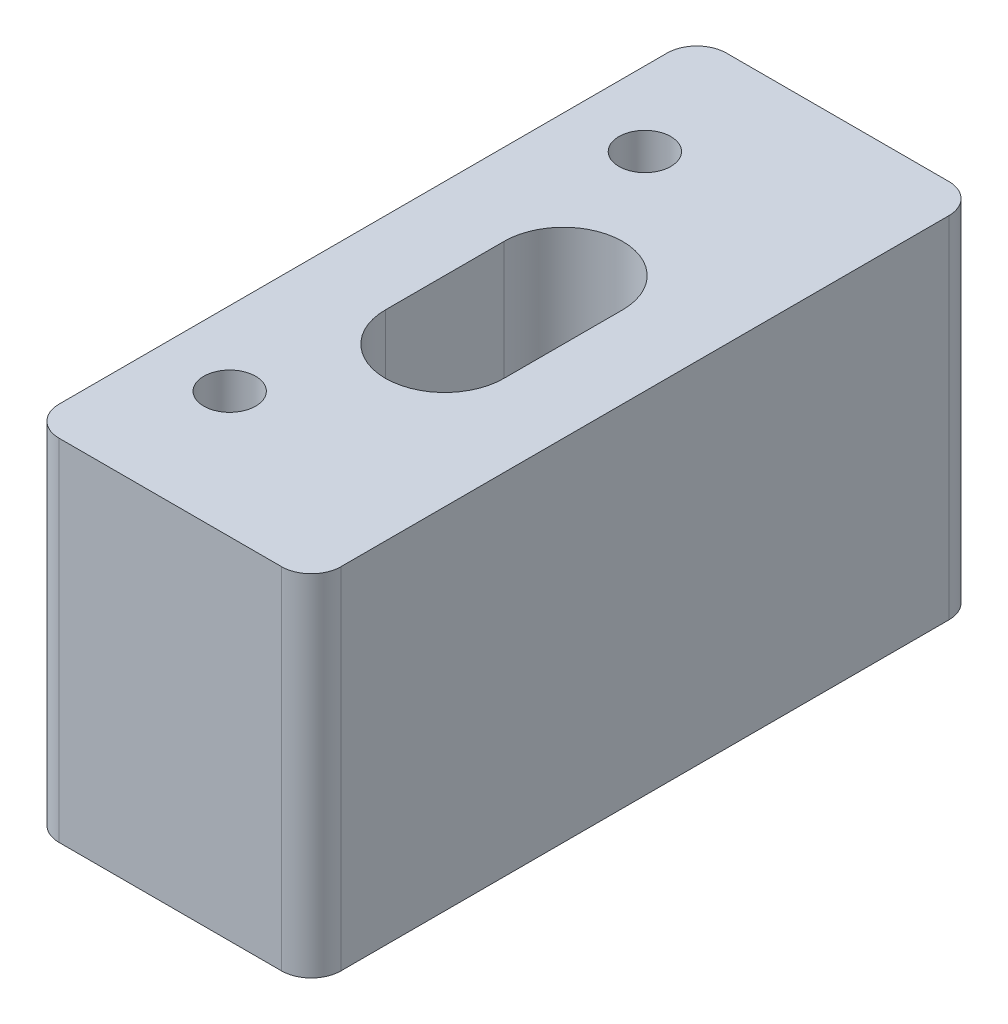
ISO-10303-21;
HEADER;
FILE_DESCRIPTION(('STEP AP214'),'2;1');
FILE_NAME('part.step','',(''),(''),'','','');
FILE_SCHEMA(('AUTOMOTIVE_DESIGN { 1 0 10303 214 1 1 1 1 }'));
ENDSEC;
DATA;
#1=APPLICATION_CONTEXT('core data for automotive mechanical design processes');
#2=APPLICATION_PROTOCOL_DEFINITION('international standard','automotive_design',2000,#1);
#3=PRODUCT_CONTEXT('',#1,'mechanical');
#4=PRODUCT('Part','Part','',(#3));
#5=PRODUCT_RELATED_PRODUCT_CATEGORY('part','',(#4));
#6=PRODUCT_DEFINITION_FORMATION('','',#4);
#7=PRODUCT_DEFINITION_CONTEXT('part definition',#1,'design');
#8=PRODUCT_DEFINITION('design','',#6,#7);
#9=PRODUCT_DEFINITION_SHAPE('','',#8);
#10=(LENGTH_UNIT() NAMED_UNIT(*) SI_UNIT(.MILLI.,.METRE.));
#11=(NAMED_UNIT(*) PLANE_ANGLE_UNIT() SI_UNIT($,.RADIAN.));
#12=(NAMED_UNIT(*) SI_UNIT($,.STERADIAN.) SOLID_ANGLE_UNIT());
#13=UNCERTAINTY_MEASURE_WITH_UNIT(LENGTH_MEASURE(1.E-05),#10,'distance_accuracy_value','');
#14=(GEOMETRIC_REPRESENTATION_CONTEXT(3) GLOBAL_UNCERTAINTY_ASSIGNED_CONTEXT((#13)) GLOBAL_UNIT_ASSIGNED_CONTEXT((#10,
#11,#12)) REPRESENTATION_CONTEXT('',''));
#15=CARTESIAN_POINT('',(0.,0.,0.));
#16=DIRECTION('',(0.,0.,1.));
#17=DIRECTION('',(1.,0.,0.));
#18=AXIS2_PLACEMENT_3D('',#15,#16,#17);
#19=CARTESIAN_POINT('',(0.,0.,0.));
#20=DIRECTION('',(0.,1.,0.));
#21=DIRECTION('',(0.,0.,1.));
#22=AXIS2_PLACEMENT_3D('',#19,#20,#21);
#23=PLANE('',#22);
#24=DIRECTION('',(0.,0.,-1.));
#25=VECTOR('',#24,1.);
#26=CARTESIAN_POINT('',(8.49999999999999,0.,-4.));
#27=LINE('',#26,#25);
#28=CARTESIAN_POINT('',(8.49999999999999,0.,4.));
#29=VERTEX_POINT('',#28);
#30=CARTESIAN_POINT('',(8.49999999999999,0.,-4.));
#31=VERTEX_POINT('',#30);
#32=EDGE_CURVE('E139',#29,#31,#27,.T.);
#33=ORIENTED_EDGE('',*,*,#32,.T.);
#34=CARTESIAN_POINT('',(4.49999999999999,0.,-4.));
#35=DIRECTION('',(0.,1.,0.));
#36=DIRECTION('',(0.,0.,1.));
#37=AXIS2_PLACEMENT_3D('',#34,#35,#36);
#38=CIRCLE('',#37,4.);
#39=CARTESIAN_POINT('',(0.499999999999994,0.,-4.));
#40=VERTEX_POINT('',#39);
#41=EDGE_CURVE('E156',#31,#40,#38,.T.);
#42=ORIENTED_EDGE('',*,*,#41,.T.);
#43=DIRECTION('',(0.,0.,1.));
#44=VECTOR('',#43,1.);
#45=CARTESIAN_POINT('',(0.499999999999994,0.,-4.));
#46=LINE('',#45,#44);
#47=CARTESIAN_POINT('',(0.499999999999994,0.,4.));
#48=VERTEX_POINT('',#47);
#49=EDGE_CURVE('E133',#40,#48,#46,.T.);
#50=ORIENTED_EDGE('',*,*,#49,.T.);
#51=CARTESIAN_POINT('',(4.49999999999999,0.,4.));
#52=DIRECTION('',(0.,1.,0.));
#53=DIRECTION('',(0.,0.,1.));
#54=AXIS2_PLACEMENT_3D('',#51,#52,#53);
#55=CIRCLE('',#54,4.);
#56=EDGE_CURVE('E53',#48,#29,#55,.T.);
#57=ORIENTED_EDGE('',*,*,#56,.T.);
#58=EDGE_LOOP('',(#33,#42,#50,#57));
#59=FACE_BOUND('',#58,.T.);
#60=DIRECTION('',(0.,0.,1.));
#61=VECTOR('',#60,1.);
#62=CARTESIAN_POINT('',(-5.00000000000001,0.,-22.5));
#63=LINE('',#62,#61);
#64=CARTESIAN_POINT('',(-5.00000000000001,0.,-20.5));
#65=VERTEX_POINT('',#64);
#66=CARTESIAN_POINT('',(-5.00000000000001,0.,20.5));
#67=VERTEX_POINT('',#66);
#68=EDGE_CURVE('E182',#65,#67,#63,.T.);
#69=ORIENTED_EDGE('',*,*,#68,.F.);
#70=CARTESIAN_POINT('',(-3.00000000000001,0.,-20.5));
#71=DIRECTION('',(0.,1.,0.));
#72=DIRECTION('',(0.,0.,1.));
#73=AXIS2_PLACEMENT_3D('',#70,#71,#72);
#74=CIRCLE('',#73,2.);
#75=CARTESIAN_POINT('',(-3.00000000000001,0.,-22.5));
#76=VERTEX_POINT('',#75);
#77=EDGE_CURVE('E203',#65,#76,#74,.F.);
#78=ORIENTED_EDGE('',*,*,#77,.T.);
#79=DIRECTION('',(-1.,0.,0.));
#80=VECTOR('',#79,1.);
#81=CARTESIAN_POINT('',(-5.00000000000001,0.,-22.5));
#82=LINE('',#81,#80);
#83=CARTESIAN_POINT('',(12.,0.,-22.5));
#84=VERTEX_POINT('',#83);
#85=EDGE_CURVE('E190',#84,#76,#82,.T.);
#86=ORIENTED_EDGE('',*,*,#85,.F.);
#87=CARTESIAN_POINT('',(12.,0.,-20.5));
#88=DIRECTION('',(0.,1.,0.));
#89=DIRECTION('',(0.,0.,1.));
#90=AXIS2_PLACEMENT_3D('',#87,#88,#89);
#91=CIRCLE('',#90,2.);
#92=CARTESIAN_POINT('',(14.,0.,-20.5));
#93=VERTEX_POINT('',#92);
#94=EDGE_CURVE('E201',#84,#93,#91,.F.);
#95=ORIENTED_EDGE('',*,*,#94,.T.);
#96=DIRECTION('',(0.,0.,-1.));
#97=VECTOR('',#96,1.);
#98=CARTESIAN_POINT('',(14.,0.,-22.5));
#99=LINE('',#98,#97);
#100=CARTESIAN_POINT('',(14.,0.,20.5));
#101=VERTEX_POINT('',#100);
#102=EDGE_CURVE('E187',#101,#93,#99,.T.);
#103=ORIENTED_EDGE('',*,*,#102,.F.);
#104=CARTESIAN_POINT('',(12.,0.,20.5));
#105=DIRECTION('',(0.,1.,0.));
#106=DIRECTION('',(0.,0.,1.));
#107=AXIS2_PLACEMENT_3D('',#104,#105,#106);
#108=CIRCLE('',#107,2.);
#109=CARTESIAN_POINT('',(12.,0.,22.5));
#110=VERTEX_POINT('',#109);
#111=EDGE_CURVE('E61',#101,#110,#108,.F.);
#112=ORIENTED_EDGE('',*,*,#111,.T.);
#113=DIRECTION('',(1.,0.,0.));
#114=VECTOR('',#113,1.);
#115=CARTESIAN_POINT('',(-5.00000000000001,0.,22.5));
#116=LINE('',#115,#114);
#117=CARTESIAN_POINT('',(-3.00000000000001,0.,22.5));
#118=VERTEX_POINT('',#117);
#119=EDGE_CURVE('E185',#118,#110,#116,.T.);
#120=ORIENTED_EDGE('',*,*,#119,.F.);
#121=CARTESIAN_POINT('',(-3.00000000000001,0.,20.5));
#122=DIRECTION('',(0.,1.,0.));
#123=DIRECTION('',(0.,0.,1.));
#124=AXIS2_PLACEMENT_3D('',#121,#122,#123);
#125=CIRCLE('',#124,2.);
#126=EDGE_CURVE('E199',#118,#67,#125,.F.);
#127=ORIENTED_EDGE('',*,*,#126,.T.);
#128=EDGE_LOOP('',(#69,#78,#86,#95,#103,#112,#120,#127));
#129=FACE_BOUND('',#128,.T.);
#130=CARTESIAN_POINT('',(0.,0.,14.));
#131=DIRECTION('',(0.,1.,0.));
#132=DIRECTION('',(0.,0.,1.));
#133=AXIS2_PLACEMENT_3D('',#130,#131,#132);
#134=CIRCLE('',#133,1.75);
#135=CARTESIAN_POINT('',(0.,0.,15.75));
#136=VERTEX_POINT('',#135);
#137=EDGE_CURVE('E179',#136,#136,#134,.T.);
#138=ORIENTED_EDGE('',*,*,#137,.T.);
#139=EDGE_LOOP('',(#138));
#140=FACE_BOUND('',#139,.T.);
#141=CARTESIAN_POINT('',(0.,0.,-14.));
#142=DIRECTION('',(0.,1.,0.));
#143=DIRECTION('',(0.,0.,1.));
#144=AXIS2_PLACEMENT_3D('',#141,#142,#143);
#145=CIRCLE('',#144,1.75);
#146=CARTESIAN_POINT('',(0.,0.,-12.25));
#147=VERTEX_POINT('',#146);
#148=EDGE_CURVE('E173',#147,#147,#145,.T.);
#149=ORIENTED_EDGE('',*,*,#148,.T.);
#150=EDGE_LOOP('',(#149));
#151=FACE_BOUND('',#150,.T.);
#152=ADVANCED_FACE('F38',(#59,#129,#140,#151),#23,.F.);
#153=CARTESIAN_POINT('',(-5.00000000000001,2.,-22.5));
#154=DIRECTION('',(1.,0.,0.));
#155=DIRECTION('',(0.,0.,-1.));
#156=AXIS2_PLACEMENT_3D('',#153,#154,#155);
#157=PLANE('',#156);
#158=DIRECTION('',(0.,-1.,0.));
#159=VECTOR('',#158,1.);
#160=CARTESIAN_POINT('',(-5.00000000000001,2.,20.5));
#161=LINE('',#160,#159);
#162=CARTESIAN_POINT('',(-5.00000000000001,23.6126983722067,20.5));
#163=VERTEX_POINT('',#162);
#164=EDGE_CURVE('E193',#67,#163,#161,.F.);
#165=ORIENTED_EDGE('',*,*,#164,.T.);
#166=DIRECTION('',(0.,0.,-1.));
#167=VECTOR('',#166,1.);
#168=CARTESIAN_POINT('',(-5.00000000000001,23.6126983722068,-20.5000000000001));
#169=LINE('',#168,#167);
#170=CARTESIAN_POINT('',(-5.00000000000001,23.6126983722068,-20.5));
#171=VERTEX_POINT('',#170);
#172=EDGE_CURVE('E236',#163,#171,#169,.T.);
#173=ORIENTED_EDGE('',*,*,#172,.T.);
#174=DIRECTION('',(0.,-1.,0.));
#175=VECTOR('',#174,1.);
#176=CARTESIAN_POINT('',(-5.00000000000001,2.,-20.5));
#177=LINE('',#176,#175);
#178=EDGE_CURVE('E195',#171,#65,#177,.T.);
#179=ORIENTED_EDGE('',*,*,#178,.T.);
#180=ORIENTED_EDGE('',*,*,#68,.T.);
#181=EDGE_LOOP('',(#165,#173,#179,#180));
#182=FACE_BOUND('',#181,.T.);
#183=ADVANCED_FACE('F259',(#182),#157,.F.);
#184=CARTESIAN_POINT('',(-5.00000000000001,2.,22.5));
#185=DIRECTION('',(0.,0.,-1.));
#186=DIRECTION('',(-1.,0.,0.));
#187=AXIS2_PLACEMENT_3D('',#184,#185,#186);
#188=PLANE('',#187);
#189=DIRECTION('',(0.,-1.,0.));
#190=VECTOR('',#189,1.);
#191=CARTESIAN_POINT('',(12.,2.,22.5));
#192=LINE('',#191,#190);
#193=CARTESIAN_POINT('',(12.,23.6126983722068,22.5));
#194=VERTEX_POINT('',#193);
#195=EDGE_CURVE('E46',#110,#194,#192,.F.);
#196=ORIENTED_EDGE('',*,*,#195,.T.);
#197=DIRECTION('',(-1.,0.,0.));
#198=VECTOR('',#197,1.);
#199=CARTESIAN_POINT('',(-2.9999999999999,23.6126983722067,22.5));
#200=LINE('',#199,#198);
#201=CARTESIAN_POINT('',(-3.00000000000001,23.6126983722067,22.5));
#202=VERTEX_POINT('',#201);
#203=EDGE_CURVE('E219',#194,#202,#200,.T.);
#204=ORIENTED_EDGE('',*,*,#203,.T.);
#205=DIRECTION('',(0.,-1.,0.));
#206=VECTOR('',#205,1.);
#207=CARTESIAN_POINT('',(-3.00000000000001,2.,22.5));
#208=LINE('',#207,#206);
#209=EDGE_CURVE('E11',#202,#118,#208,.T.);
#210=ORIENTED_EDGE('',*,*,#209,.T.);
#211=ORIENTED_EDGE('',*,*,#119,.T.);
#212=EDGE_LOOP('',(#196,#204,#210,#211));
#213=FACE_BOUND('',#212,.T.);
#214=ADVANCED_FACE('F218',(#213),#188,.F.);
#215=CARTESIAN_POINT('',(14.,2.,-22.5));
#216=DIRECTION('',(-1.,0.,0.));
#217=DIRECTION('',(0.,0.,1.));
#218=AXIS2_PLACEMENT_3D('',#215,#216,#217);
#219=PLANE('',#218);
#220=ORIENTED_EDGE('',*,*,#102,.T.);
#221=DIRECTION('',(0.,-1.,0.));
#222=VECTOR('',#221,1.);
#223=CARTESIAN_POINT('',(14.,2.,-20.5));
#224=LINE('',#223,#222);
#225=CARTESIAN_POINT('',(14.,23.6126983722068,-20.5));
#226=VERTEX_POINT('',#225);
#227=EDGE_CURVE('E213',#93,#226,#224,.F.);
#228=ORIENTED_EDGE('',*,*,#227,.T.);
#229=DIRECTION('',(0.,0.,1.));
#230=VECTOR('',#229,1.);
#231=CARTESIAN_POINT('',(14.,23.6126983722068,20.4999999999999));
#232=LINE('',#231,#230);
#233=CARTESIAN_POINT('',(14.,23.6126983722068,20.5));
#234=VERTEX_POINT('',#233);
#235=EDGE_CURVE('E166',#226,#234,#232,.T.);
#236=ORIENTED_EDGE('',*,*,#235,.T.);
#237=DIRECTION('',(0.,-1.,0.));
#238=VECTOR('',#237,1.);
#239=CARTESIAN_POINT('',(14.,2.,20.5));
#240=LINE('',#239,#238);
#241=EDGE_CURVE('E210',#234,#101,#240,.T.);
#242=ORIENTED_EDGE('',*,*,#241,.T.);
#243=EDGE_LOOP('',(#220,#228,#236,#242));
#244=FACE_BOUND('',#243,.T.);
#245=ADVANCED_FACE('F266',(#244),#219,.F.);
#246=CARTESIAN_POINT('',(-5.00000000000001,2.,-22.5));
#247=DIRECTION('',(0.,0.,1.));
#248=DIRECTION('',(1.,0.,0.));
#249=AXIS2_PLACEMENT_3D('',#246,#247,#248);
#250=PLANE('',#249);
#251=ORIENTED_EDGE('',*,*,#85,.T.);
#252=DIRECTION('',(0.,-1.,0.));
#253=VECTOR('',#252,1.);
#254=CARTESIAN_POINT('',(-3.00000000000001,2.,-22.5));
#255=LINE('',#254,#253);
#256=CARTESIAN_POINT('',(-3.00000000000001,23.6126983722068,-22.5));
#257=VERTEX_POINT('',#256);
#258=EDGE_CURVE('E208',#76,#257,#255,.F.);
#259=ORIENTED_EDGE('',*,*,#258,.T.);
#260=DIRECTION('',(1.,0.,0.));
#261=VECTOR('',#260,1.);
#262=CARTESIAN_POINT('',(12.0000000000001,23.6126983722068,-22.5));
#263=LINE('',#262,#261);
#264=CARTESIAN_POINT('',(12.,23.6126983722068,-22.5));
#265=VERTEX_POINT('',#264);
#266=EDGE_CURVE('E242',#257,#265,#263,.T.);
#267=ORIENTED_EDGE('',*,*,#266,.T.);
#268=DIRECTION('',(0.,-1.,0.));
#269=VECTOR('',#268,1.);
#270=CARTESIAN_POINT('',(12.,2.,-22.5));
#271=LINE('',#270,#269);
#272=EDGE_CURVE('E205',#265,#84,#271,.T.);
#273=ORIENTED_EDGE('',*,*,#272,.T.);
#274=EDGE_LOOP('',(#251,#259,#267,#273));
#275=FACE_BOUND('',#274,.T.);
#276=ADVANCED_FACE('F253',(#275),#250,.F.);
#277=CARTESIAN_POINT('',(0.,2.,14.));
#278=DIRECTION('',(0.,-1.,0.));
#279=DIRECTION('',(0.,0.,-1.));
#280=AXIS2_PLACEMENT_3D('',#277,#278,#279);
#281=CYLINDRICAL_SURFACE('',#280,1.75);
#282=ORIENTED_EDGE('',*,*,#137,.F.);
#283=EDGE_LOOP('',(#282));
#284=FACE_BOUND('',#283,.T.);
#285=CARTESIAN_POINT('',(0.,23.6126983722068,14.));
#286=DIRECTION('',(0.,-1.,0.));
#287=DIRECTION('',(1.,0.,0.));
#288=AXIS2_PLACEMENT_3D('',#285,#286,#287);
#289=CIRCLE('',#288,1.75);
#290=CARTESIAN_POINT('',(1.75,23.6126983722068,14.));
#291=VERTEX_POINT('',#290);
#292=EDGE_CURVE('E163',#291,#291,#289,.T.);
#293=ORIENTED_EDGE('',*,*,#292,.F.);
#294=EDGE_LOOP('',(#293));
#295=FACE_BOUND('',#294,.T.);
#296=ADVANCED_FACE('F273',(#284,#295),#281,.F.);
#297=CARTESIAN_POINT('',(0.,2.,-14.));
#298=DIRECTION('',(0.,-1.,0.));
#299=DIRECTION('',(0.,0.,-1.));
#300=AXIS2_PLACEMENT_3D('',#297,#298,#299);
#301=CYLINDRICAL_SURFACE('',#300,1.75);
#302=ORIENTED_EDGE('',*,*,#148,.F.);
#303=EDGE_LOOP('',(#302));
#304=FACE_BOUND('',#303,.T.);
#305=CARTESIAN_POINT('',(0.,23.6126983722068,-14.));
#306=DIRECTION('',(0.,-1.,0.));
#307=DIRECTION('',(1.,0.,0.));
#308=AXIS2_PLACEMENT_3D('',#305,#306,#307);
#309=CIRCLE('',#308,1.75);
#310=CARTESIAN_POINT('',(1.75,23.6126983722068,-14.));
#311=VERTEX_POINT('',#310);
#312=EDGE_CURVE('E160',#311,#311,#309,.T.);
#313=ORIENTED_EDGE('',*,*,#312,.F.);
#314=EDGE_LOOP('',(#313));
#315=FACE_BOUND('',#314,.T.);
#316=ADVANCED_FACE('F286',(#304,#315),#301,.F.);
#317=CARTESIAN_POINT('',(-3.00000000000001,2.,-20.5));
#318=DIRECTION('',(0.,-1.,0.));
#319=DIRECTION('',(0.,0.,-1.));
#320=AXIS2_PLACEMENT_3D('',#317,#318,#319);
#321=CYLINDRICAL_SURFACE('',#320,2.);
#322=ORIENTED_EDGE('',*,*,#178,.F.);
#323=CARTESIAN_POINT('',(-3.00000000000001,23.6126983722068,-20.5));
#324=DIRECTION('',(0.,-1.,0.));
#325=DIRECTION('',(1.,0.,0.));
#326=AXIS2_PLACEMENT_3D('',#323,#324,#325);
#327=CIRCLE('',#326,2.);
#328=EDGE_CURVE('E239',#171,#257,#327,.T.);
#329=ORIENTED_EDGE('',*,*,#328,.T.);
#330=ORIENTED_EDGE('',*,*,#258,.F.);
#331=ORIENTED_EDGE('',*,*,#77,.F.);
#332=EDGE_LOOP('',(#322,#329,#330,#331));
#333=FACE_BOUND('',#332,.T.);
#334=ADVANCED_FACE('F257',(#333),#321,.T.);
#335=CARTESIAN_POINT('',(12.,2.,-20.5));
#336=DIRECTION('',(0.,-1.,0.));
#337=DIRECTION('',(0.,0.,-1.));
#338=AXIS2_PLACEMENT_3D('',#335,#336,#337);
#339=CYLINDRICAL_SURFACE('',#338,2.);
#340=ORIENTED_EDGE('',*,*,#272,.F.);
#341=CARTESIAN_POINT('',(12.,23.6126983722068,-20.5));
#342=DIRECTION('',(0.,-1.,0.));
#343=DIRECTION('',(1.,0.,0.));
#344=AXIS2_PLACEMENT_3D('',#341,#342,#343);
#345=CIRCLE('',#344,2.);
#346=EDGE_CURVE('E245',#265,#226,#345,.T.);
#347=ORIENTED_EDGE('',*,*,#346,.T.);
#348=ORIENTED_EDGE('',*,*,#227,.F.);
#349=ORIENTED_EDGE('',*,*,#94,.F.);
#350=EDGE_LOOP('',(#340,#347,#348,#349));
#351=FACE_BOUND('',#350,.T.);
#352=ADVANCED_FACE('F250',(#351),#339,.T.);
#353=CARTESIAN_POINT('',(-3.00000000000001,2.,20.5));
#354=DIRECTION('',(0.,-1.,0.));
#355=DIRECTION('',(0.,0.,-1.));
#356=AXIS2_PLACEMENT_3D('',#353,#354,#355);
#357=CYLINDRICAL_SURFACE('',#356,2.);
#358=ORIENTED_EDGE('',*,*,#209,.F.);
#359=CARTESIAN_POINT('',(-3.00000000000001,23.6126983722067,20.5));
#360=DIRECTION('',(0.,-1.,0.));
#361=DIRECTION('',(1.,0.,0.));
#362=AXIS2_PLACEMENT_3D('',#359,#360,#361);
#363=CIRCLE('',#362,2.);
#364=EDGE_CURVE('E230',#202,#163,#363,.T.);
#365=ORIENTED_EDGE('',*,*,#364,.T.);
#366=ORIENTED_EDGE('',*,*,#164,.F.);
#367=ORIENTED_EDGE('',*,*,#126,.F.);
#368=EDGE_LOOP('',(#358,#365,#366,#367));
#369=FACE_BOUND('',#368,.T.);
#370=ADVANCED_FACE('F263',(#369),#357,.T.);
#371=CARTESIAN_POINT('',(12.,2.,20.5));
#372=DIRECTION('',(0.,-1.,0.));
#373=DIRECTION('',(0.,0.,-1.));
#374=AXIS2_PLACEMENT_3D('',#371,#372,#373);
#375=CYLINDRICAL_SURFACE('',#374,2.);
#376=ORIENTED_EDGE('',*,*,#241,.F.);
#377=CARTESIAN_POINT('',(12.,23.6126983722068,20.5));
#378=DIRECTION('',(0.,-1.,0.));
#379=DIRECTION('',(1.,0.,0.));
#380=AXIS2_PLACEMENT_3D('',#377,#378,#379);
#381=CIRCLE('',#380,2.);
#382=EDGE_CURVE('E226',#234,#194,#381,.T.);
#383=ORIENTED_EDGE('',*,*,#382,.T.);
#384=ORIENTED_EDGE('',*,*,#195,.F.);
#385=ORIENTED_EDGE('',*,*,#111,.F.);
#386=EDGE_LOOP('',(#376,#383,#384,#385));
#387=FACE_BOUND('',#386,.T.);
#388=ADVANCED_FACE('F40',(#387),#375,.T.);
#389=CARTESIAN_POINT('',(4.49999999999999,0.,-4.));
#390=DIRECTION('',(0.,1.,0.));
#391=DIRECTION('',(0.,0.,1.));
#392=AXIS2_PLACEMENT_3D('',#389,#390,#391);
#393=CYLINDRICAL_SURFACE('',#392,4.);
#394=DIRECTION('',(0.,1.,0.));
#395=VECTOR('',#394,1.);
#396=CARTESIAN_POINT('',(8.49999999999999,0.,-4.));
#397=LINE('',#396,#395);
#398=CARTESIAN_POINT('',(8.49999999999999,23.6126983722068,-4.));
#399=VERTEX_POINT('',#398);
#400=EDGE_CURVE('E153',#31,#399,#397,.T.);
#401=ORIENTED_EDGE('',*,*,#400,.T.);
#402=CARTESIAN_POINT('',(4.49999999999999,23.6126983722068,-4.));
#403=DIRECTION('',(0.,-1.,0.));
#404=DIRECTION('',(1.,0.,0.));
#405=AXIS2_PLACEMENT_3D('',#402,#403,#404);
#406=CIRCLE('',#405,4.);
#407=CARTESIAN_POINT('',(0.499999999999994,23.6126983722068,-4.));
#408=VERTEX_POINT('',#407);
#409=EDGE_CURVE('E147',#408,#399,#406,.T.);
#410=ORIENTED_EDGE('',*,*,#409,.F.);
#411=DIRECTION('',(0.,1.,0.));
#412=VECTOR('',#411,1.);
#413=CARTESIAN_POINT('',(0.499999999999994,0.,-4.));
#414=LINE('',#413,#412);
#415=EDGE_CURVE('E128',#40,#408,#414,.T.);
#416=ORIENTED_EDGE('',*,*,#415,.F.);
#417=ORIENTED_EDGE('',*,*,#41,.F.);
#418=EDGE_LOOP('',(#401,#410,#416,#417));
#419=FACE_BOUND('',#418,.T.);
#420=ADVANCED_FACE('F152',(#419),#393,.F.);
#421=CARTESIAN_POINT('',(8.49999999999999,0.,-4.));
#422=DIRECTION('',(1.,0.,0.));
#423=DIRECTION('',(0.,0.,-1.));
#424=AXIS2_PLACEMENT_3D('',#421,#422,#423);
#425=PLANE('',#424);
#426=DIRECTION('',(0.,1.,0.));
#427=VECTOR('',#426,1.);
#428=CARTESIAN_POINT('',(8.49999999999999,0.,4.));
#429=LINE('',#428,#427);
#430=CARTESIAN_POINT('',(8.49999999999999,23.6126983722068,4.));
#431=VERTEX_POINT('',#430);
#432=EDGE_CURVE('E174',#29,#431,#429,.T.);
#433=ORIENTED_EDGE('',*,*,#432,.T.);
#434=DIRECTION('',(0.,0.,1.));
#435=VECTOR('',#434,1.);
#436=CARTESIAN_POINT('',(8.49999999999999,23.6126983722068,3.99999999999992));
#437=LINE('',#436,#435);
#438=EDGE_CURVE('E154',#399,#431,#437,.T.);
#439=ORIENTED_EDGE('',*,*,#438,.F.);
#440=ORIENTED_EDGE('',*,*,#400,.F.);
#441=ORIENTED_EDGE('',*,*,#32,.F.);
#442=EDGE_LOOP('',(#433,#439,#440,#441));
#443=FACE_BOUND('',#442,.T.);
#444=ADVANCED_FACE('F293',(#443),#425,.F.);
#445=CARTESIAN_POINT('',(4.49999999999999,0.,4.));
#446=DIRECTION('',(0.,1.,0.));
#447=DIRECTION('',(0.,0.,1.));
#448=AXIS2_PLACEMENT_3D('',#445,#446,#447);
#449=CYLINDRICAL_SURFACE('',#448,4.);
#450=DIRECTION('',(0.,1.,0.));
#451=VECTOR('',#450,1.);
#452=CARTESIAN_POINT('',(0.499999999999994,0.,4.));
#453=LINE('',#452,#451);
#454=CARTESIAN_POINT('',(0.499999999999994,23.6126983722068,4.));
#455=VERTEX_POINT('',#454);
#456=EDGE_CURVE('E138',#48,#455,#453,.T.);
#457=ORIENTED_EDGE('',*,*,#456,.T.);
#458=CARTESIAN_POINT('',(4.49999999999999,23.6126983722068,4.));
#459=DIRECTION('',(0.,-1.,0.));
#460=DIRECTION('',(1.,0.,0.));
#461=AXIS2_PLACEMENT_3D('',#458,#459,#460);
#462=CIRCLE('',#461,4.);
#463=EDGE_CURVE('E150',#431,#455,#462,.T.);
#464=ORIENTED_EDGE('',*,*,#463,.F.);
#465=ORIENTED_EDGE('',*,*,#432,.F.);
#466=ORIENTED_EDGE('',*,*,#56,.F.);
#467=EDGE_LOOP('',(#457,#464,#465,#466));
#468=FACE_BOUND('',#467,.T.);
#469=ADVANCED_FACE('F296',(#468),#449,.F.);
#470=CARTESIAN_POINT('',(0.499999999999994,0.,-4.));
#471=DIRECTION('',(-1.,0.,0.));
#472=DIRECTION('',(0.,0.,1.));
#473=AXIS2_PLACEMENT_3D('',#470,#471,#472);
#474=PLANE('',#473);
#475=ORIENTED_EDGE('',*,*,#415,.T.);
#476=DIRECTION('',(0.,0.,-1.));
#477=VECTOR('',#476,1.);
#478=CARTESIAN_POINT('',(0.499999999999994,23.6126983722068,-4.00000000000008));
#479=LINE('',#478,#477);
#480=EDGE_CURVE('E131',#455,#408,#479,.T.);
#481=ORIENTED_EDGE('',*,*,#480,.F.);
#482=ORIENTED_EDGE('',*,*,#456,.F.);
#483=ORIENTED_EDGE('',*,*,#49,.F.);
#484=EDGE_LOOP('',(#475,#481,#482,#483));
#485=FACE_BOUND('',#484,.T.);
#486=ADVANCED_FACE('F130',(#485),#474,.F.);
#487=CARTESIAN_POINT('',(75.0099999999996,23.6126983722069,-1.94289029309402E-13));
#488=DIRECTION('',(0.,-1.,0.));
#489=DIRECTION('',(0.,0.,1.));
#490=AXIS2_PLACEMENT_3D('',#487,#488,#489);
#491=PLANE('',#490);
#492=ORIENTED_EDGE('',*,*,#292,.T.);
#493=EDGE_LOOP('',(#492));
#494=FACE_BOUND('',#493,.T.);
#495=ORIENTED_EDGE('',*,*,#312,.T.);
#496=EDGE_LOOP('',(#495));
#497=FACE_BOUND('',#496,.T.);
#498=ORIENTED_EDGE('',*,*,#463,.T.);
#499=ORIENTED_EDGE('',*,*,#480,.T.);
#500=ORIENTED_EDGE('',*,*,#409,.T.);
#501=ORIENTED_EDGE('',*,*,#438,.T.);
#502=EDGE_LOOP('',(#498,#499,#500,#501));
#503=FACE_BOUND('',#502,.T.);
#504=ORIENTED_EDGE('',*,*,#266,.F.);
#505=ORIENTED_EDGE('',*,*,#328,.F.);
#506=ORIENTED_EDGE('',*,*,#172,.F.);
#507=ORIENTED_EDGE('',*,*,#364,.F.);
#508=ORIENTED_EDGE('',*,*,#203,.F.);
#509=ORIENTED_EDGE('',*,*,#382,.F.);
#510=ORIENTED_EDGE('',*,*,#235,.F.);
#511=ORIENTED_EDGE('',*,*,#346,.F.);
#512=EDGE_LOOP('',(#504,#505,#506,#507,#508,#509,#510,#511));
#513=FACE_BOUND('',#512,.T.);
#514=ADVANCED_FACE('F144',(#494,#497,#503,#513),#491,.F.);
#515=CLOSED_SHELL('',(#152,#183,#214,#245,#276,#296,#316,#334,#352,#370,#388,#420,#444,#469,
#486,#514));
#516=MANIFOLD_SOLID_BREP('B2',#515);
#517=ADVANCED_BREP_SHAPE_REPRESENTATION('',(#18,#516),#14);
#518=SHAPE_DEFINITION_REPRESENTATION(#9,#517);
ENDSEC;
END-ISO-10303-21;
